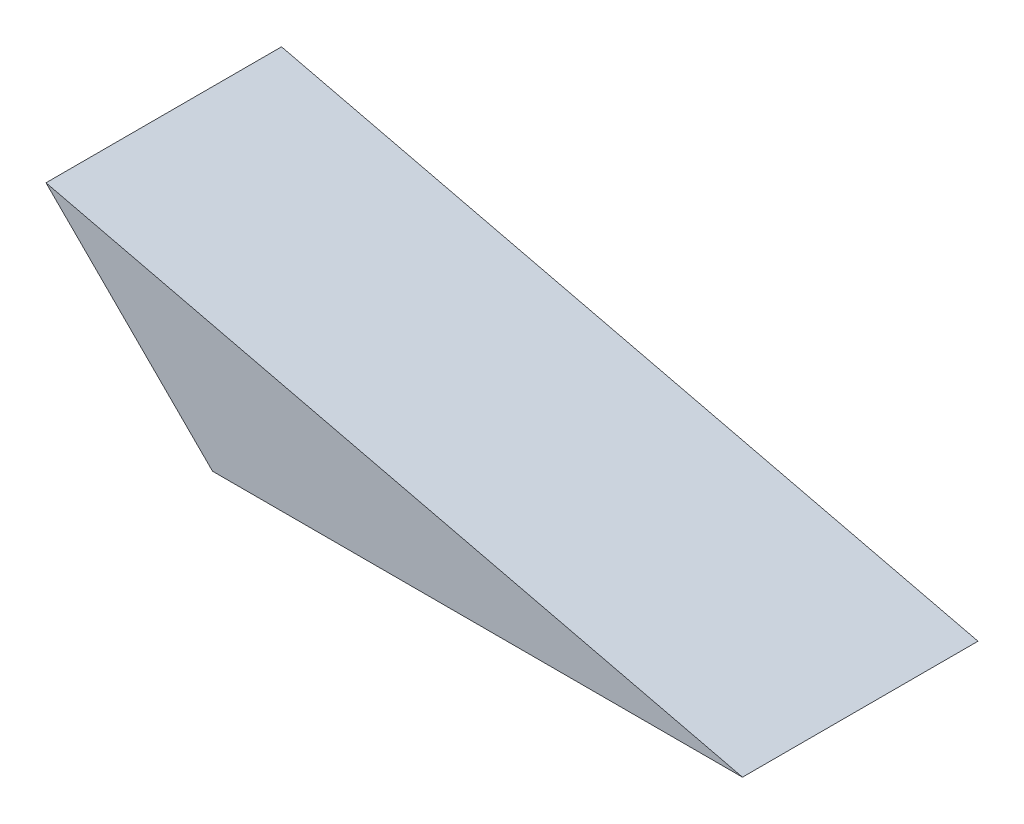
ISO-10303-21;
HEADER;
FILE_DESCRIPTION(('STEP AP214'),'2;1');
FILE_NAME('part.step','',(''),(''),'','','');
FILE_SCHEMA(('AUTOMOTIVE_DESIGN { 1 0 10303 214 1 1 1 1 }'));
ENDSEC;
DATA;
#1=APPLICATION_CONTEXT('core data for automotive mechanical design processes');
#2=APPLICATION_PROTOCOL_DEFINITION('international standard','automotive_design',2000,#1);
#3=PRODUCT_CONTEXT('',#1,'mechanical');
#4=PRODUCT('Part','Part','',(#3));
#5=PRODUCT_RELATED_PRODUCT_CATEGORY('part','',(#4));
#6=PRODUCT_DEFINITION_FORMATION('','',#4);
#7=PRODUCT_DEFINITION_CONTEXT('part definition',#1,'design');
#8=PRODUCT_DEFINITION('design','',#6,#7);
#9=PRODUCT_DEFINITION_SHAPE('','',#8);
#10=(LENGTH_UNIT() NAMED_UNIT(*) SI_UNIT(.MILLI.,.METRE.));
#11=(NAMED_UNIT(*) PLANE_ANGLE_UNIT() SI_UNIT($,.RADIAN.));
#12=(NAMED_UNIT(*) SI_UNIT($,.STERADIAN.) SOLID_ANGLE_UNIT());
#13=UNCERTAINTY_MEASURE_WITH_UNIT(LENGTH_MEASURE(1.E-05),#10,'distance_accuracy_value','');
#14=(GEOMETRIC_REPRESENTATION_CONTEXT(3) GLOBAL_UNCERTAINTY_ASSIGNED_CONTEXT((#13)) GLOBAL_UNIT_ASSIGNED_CONTEXT((#10,
#11,#12)) REPRESENTATION_CONTEXT('',''));
#15=CARTESIAN_POINT('',(0.,0.,0.));
#16=DIRECTION('',(0.,0.,1.));
#17=DIRECTION('',(1.,0.,0.));
#18=AXIS2_PLACEMENT_3D('',#15,#16,#17);
#19=CARTESIAN_POINT('',(-2.82842712474618,2.8284271247462,4.));
#20=DIRECTION('',(0.707106781186549,0.707106781186546,0.));
#21=DIRECTION('',(-0.707106781186546,0.707106781186549,0.));
#22=AXIS2_PLACEMENT_3D('',#19,#20,#21);
#23=PLANE('',#22);
#24=DIRECTION('',(0.707106781186546,-0.707106781186549,0.));
#25=VECTOR('',#24,1.);
#26=CARTESIAN_POINT('',(-2.82842712474618,2.8284271247462,0.));
#27=LINE('',#26,#25);
#28=CARTESIAN_POINT('',(-2.82842712474618,2.8284271247462,0.));
#29=VERTEX_POINT('',#28);
#30=CARTESIAN_POINT('',(0.,0.,0.));
#31=VERTEX_POINT('',#30);
#32=EDGE_CURVE('E80',#29,#31,#27,.T.);
#33=ORIENTED_EDGE('',*,*,#32,.T.);
#34=DIRECTION('',(0.,0.,-1.));
#35=VECTOR('',#34,1.);
#36=CARTESIAN_POINT('',(0.,0.,4.));
#37=LINE('',#36,#35);
#38=CARTESIAN_POINT('',(0.,0.,4.));
#39=VERTEX_POINT('',#38);
#40=EDGE_CURVE('E11',#39,#31,#37,.T.);
#41=ORIENTED_EDGE('',*,*,#40,.F.);
#42=DIRECTION('',(0.707106781186546,-0.707106781186549,0.));
#43=VECTOR('',#42,1.);
#44=CARTESIAN_POINT('',(-2.82842712474618,2.8284271247462,4.));
#45=LINE('',#44,#43);
#46=CARTESIAN_POINT('',(-2.82842712474618,2.8284271247462,4.));
#47=VERTEX_POINT('',#46);
#48=EDGE_CURVE('E73',#47,#39,#45,.T.);
#49=ORIENTED_EDGE('',*,*,#48,.F.);
#50=DIRECTION('',(0.,0.,-1.));
#51=VECTOR('',#50,1.);
#52=CARTESIAN_POINT('',(-2.82842712474618,2.8284271247462,4.));
#53=LINE('',#52,#51);
#54=EDGE_CURVE('E81',#47,#29,#53,.T.);
#55=ORIENTED_EDGE('',*,*,#54,.T.);
#56=EDGE_LOOP('',(#33,#41,#49,#55));
#57=FACE_BOUND('',#56,.T.);
#58=ADVANCED_FACE('F33',(#57),#23,.F.);
#59=CARTESIAN_POINT('',(0.,0.,4.));
#60=DIRECTION('',(0.,1.,0.));
#61=DIRECTION('',(0.,0.,1.));
#62=AXIS2_PLACEMENT_3D('',#59,#60,#61);
#63=PLANE('',#62);
#64=DIRECTION('',(1.,0.,0.));
#65=VECTOR('',#64,1.);
#66=CARTESIAN_POINT('',(0.,0.,0.));
#67=LINE('',#66,#65);
#68=CARTESIAN_POINT('',(9.,0.,0.));
#69=VERTEX_POINT('',#68);
#70=EDGE_CURVE('E61',#31,#69,#67,.T.);
#71=ORIENTED_EDGE('',*,*,#70,.T.);
#72=DIRECTION('',(0.,0.,-1.));
#73=VECTOR('',#72,1.);
#74=CARTESIAN_POINT('',(9.,0.,4.));
#75=LINE('',#74,#73);
#76=CARTESIAN_POINT('',(9.,0.,4.));
#77=VERTEX_POINT('',#76);
#78=EDGE_CURVE('E41',#77,#69,#75,.T.);
#79=ORIENTED_EDGE('',*,*,#78,.F.);
#80=DIRECTION('',(1.,0.,0.));
#81=VECTOR('',#80,1.);
#82=CARTESIAN_POINT('',(0.,0.,4.));
#83=LINE('',#82,#81);
#84=EDGE_CURVE('E69',#39,#77,#83,.T.);
#85=ORIENTED_EDGE('',*,*,#84,.F.);
#86=ORIENTED_EDGE('',*,*,#40,.T.);
#87=EDGE_LOOP('',(#71,#79,#85,#86));
#88=FACE_BOUND('',#87,.T.);
#89=ADVANCED_FACE('F70',(#88),#63,.F.);
#90=CARTESIAN_POINT('',(9.,0.,4.));
#91=DIRECTION('',(-0.232564673633194,-0.972580933690295,0.));
#92=DIRECTION('',(0.972580933690295,-0.232564673633194,0.));
#93=AXIS2_PLACEMENT_3D('',#90,#91,#92);
#94=PLANE('',#93);
#95=DIRECTION('',(-0.972580933690295,0.232564673633194,0.));
#96=VECTOR('',#95,1.);
#97=CARTESIAN_POINT('',(9.,0.,0.));
#98=LINE('',#97,#96);
#99=EDGE_CURVE('E66',#69,#29,#98,.T.);
#100=ORIENTED_EDGE('',*,*,#99,.T.);
#101=ORIENTED_EDGE('',*,*,#54,.F.);
#102=DIRECTION('',(-0.972580933690295,0.232564673633194,0.));
#103=VECTOR('',#102,1.);
#104=CARTESIAN_POINT('',(9.,0.,4.));
#105=LINE('',#104,#103);
#106=EDGE_CURVE('E49',#77,#47,#105,.T.);
#107=ORIENTED_EDGE('',*,*,#106,.F.);
#108=ORIENTED_EDGE('',*,*,#78,.T.);
#109=EDGE_LOOP('',(#100,#101,#107,#108));
#110=FACE_BOUND('',#109,.T.);
#111=ADVANCED_FACE('F88',(#110),#94,.F.);
#112=CARTESIAN_POINT('',(0.,0.,4.));
#113=DIRECTION('',(0.,0.,1.));
#114=DIRECTION('',(1.,0.,0.));
#115=AXIS2_PLACEMENT_3D('',#112,#113,#114);
#116=PLANE('',#115);
#117=ORIENTED_EDGE('',*,*,#48,.T.);
#118=ORIENTED_EDGE('',*,*,#84,.T.);
#119=ORIENTED_EDGE('',*,*,#106,.T.);
#120=EDGE_LOOP('',(#117,#118,#119));
#121=FACE_BOUND('',#120,.T.);
#122=ADVANCED_FACE('F76',(#121),#116,.T.);
#123=CARTESIAN_POINT('',(0.,0.,0.));
#124=DIRECTION('',(0.,0.,1.));
#125=DIRECTION('',(1.,0.,0.));
#126=AXIS2_PLACEMENT_3D('',#123,#124,#125);
#127=PLANE('',#126);
#128=ORIENTED_EDGE('',*,*,#32,.F.);
#129=ORIENTED_EDGE('',*,*,#99,.F.);
#130=ORIENTED_EDGE('',*,*,#70,.F.);
#131=EDGE_LOOP('',(#128,#129,#130));
#132=FACE_BOUND('',#131,.T.);
#133=ADVANCED_FACE('F89',(#132),#127,.F.);
#134=CLOSED_SHELL('',(#58,#89,#111,#122,#133));
#135=MANIFOLD_SOLID_BREP('B2',#134);
#136=ADVANCED_BREP_SHAPE_REPRESENTATION('',(#18,#135),#14);
#137=SHAPE_DEFINITION_REPRESENTATION(#9,#136);
ENDSEC;
END-ISO-10303-21;
